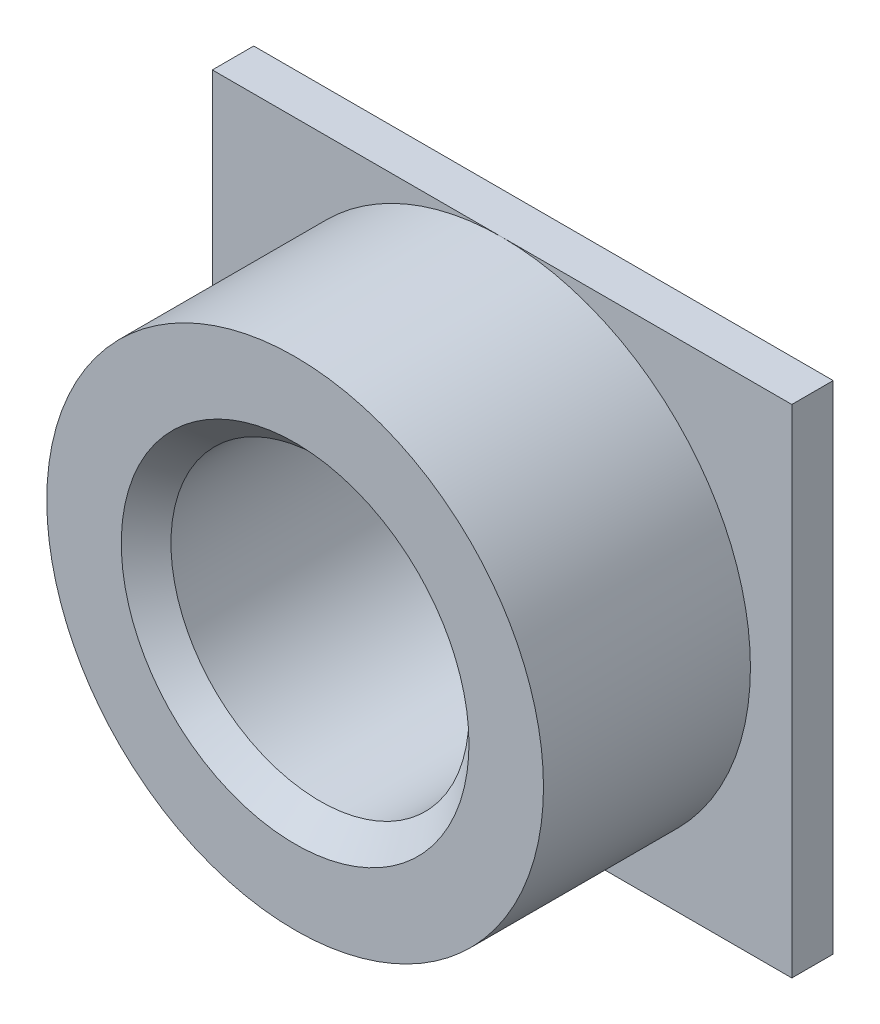
ISO-10303-21;
HEADER;
FILE_DESCRIPTION(('STEP AP214'),'2;1');
FILE_NAME('part.step','',(''),(''),'','','');
FILE_SCHEMA(('AUTOMOTIVE_DESIGN { 1 0 10303 214 1 1 1 1 }'));
ENDSEC;
DATA;
#1=APPLICATION_CONTEXT('core data for automotive mechanical design processes');
#2=APPLICATION_PROTOCOL_DEFINITION('international standard','automotive_design',2000,#1);
#3=PRODUCT_CONTEXT('',#1,'mechanical');
#4=PRODUCT('Part','Part','',(#3));
#5=PRODUCT_RELATED_PRODUCT_CATEGORY('part','',(#4));
#6=PRODUCT_DEFINITION_FORMATION('','',#4);
#7=PRODUCT_DEFINITION_CONTEXT('part definition',#1,'design');
#8=PRODUCT_DEFINITION('design','',#6,#7);
#9=PRODUCT_DEFINITION_SHAPE('','',#8);
#10=(LENGTH_UNIT() NAMED_UNIT(*) SI_UNIT(.MILLI.,.METRE.));
#11=(NAMED_UNIT(*) PLANE_ANGLE_UNIT() SI_UNIT($,.RADIAN.));
#12=(NAMED_UNIT(*) SI_UNIT($,.STERADIAN.) SOLID_ANGLE_UNIT());
#13=UNCERTAINTY_MEASURE_WITH_UNIT(LENGTH_MEASURE(1.E-05),#10,'distance_accuracy_value','');
#14=(GEOMETRIC_REPRESENTATION_CONTEXT(3) GLOBAL_UNCERTAINTY_ASSIGNED_CONTEXT((#13)) GLOBAL_UNIT_ASSIGNED_CONTEXT((#10,
#11,#12)) REPRESENTATION_CONTEXT('',''));
#15=CARTESIAN_POINT('',(0.,0.,0.));
#16=DIRECTION('',(0.,0.,1.));
#17=DIRECTION('',(1.,0.,0.));
#18=AXIS2_PLACEMENT_3D('',#15,#16,#17);
#19=CARTESIAN_POINT('',(12.799999987954,3.66000063419343,27.5000000000097));
#20=CARTESIAN_POINT('',(12.799999987954,5.46000063419343,27.5000000000097));
#21=CARTESIAN_POINT('',(10.999999987954,5.46000063419343,27.5000000000097));
#22=CARTESIAN_POINT('',(9.19999998795404,5.46000063419343,27.5000000000097));
#23=CARTESIAN_POINT('',(9.19999998795404,3.66000063419343,27.5000000000097));
#24=CARTESIAN_POINT('',(9.19999998795404,1.86000063419343,27.5000000000097));
#25=CARTESIAN_POINT('',(10.999999987954,1.86000063419343,27.5000000000097));
#26=CARTESIAN_POINT('',(12.799999987954,1.86000063419343,27.5000000000097));
#27=CARTESIAN_POINT('',(12.799999987954,3.66000063419343,27.5000000000097));
#28=CARTESIAN_POINT('',(12.799999987954,3.66000063419343,30.2000000000097));
#29=CARTESIAN_POINT('',(12.799999987954,5.46000063419343,30.2000000000097));
#30=CARTESIAN_POINT('',(10.999999987954,5.46000063419343,30.2000000000097));
#31=CARTESIAN_POINT('',(9.19999998795404,5.46000063419343,30.2000000000097));
#32=CARTESIAN_POINT('',(9.19999998795404,3.66000063419343,30.2000000000097));
#33=CARTESIAN_POINT('',(9.19999998795404,1.86000063419343,30.2000000000097));
#34=CARTESIAN_POINT('',(10.999999987954,1.86000063419343,30.2000000000097));
#35=CARTESIAN_POINT('',(12.799999987954,1.86000063419343,30.2000000000097));
#36=CARTESIAN_POINT('',(12.799999987954,3.66000063419343,30.2000000000097));
#37=(BOUNDED_SURFACE() B_SPLINE_SURFACE(1,2,((#19,#20,#21,#22,#23,#24,#25,#26,#27),(#28,#29,#30,
#31,#32,#33,#34,#35,#36)),.UNSPECIFIED.,.F.,.T.,.F.) B_SPLINE_SURFACE_WITH_KNOTS((2,2),(3,2,2,2,
3),(0.75,0.9),(0.,0.25,0.5,0.75,1.),
.UNSPECIFIED.) GEOMETRIC_REPRESENTATION_ITEM() RATIONAL_B_SPLINE_SURFACE(((1.,0.707106781186548,
1.,0.707106781186548,1.,0.707106781186548,1.,0.707106781186548,1.),(1.,0.707106781186548,1.,
0.707106781186548,1.,0.707106781186548,1.,0.707106781186548,1.))) REPRESENTATION_ITEM('') SURFACE());
#38=CARTESIAN_POINT('',(12.799999987954,3.66000063419343,30.2000000000097));
#39=CARTESIAN_POINT('',(12.799999987954,5.46000063419344,30.2000000000097));
#40=CARTESIAN_POINT('',(10.999999987954,5.46000063419343,30.2000000000097));
#41=CARTESIAN_POINT('',(9.19999998795401,5.46000063419342,30.2000000000097));
#42=CARTESIAN_POINT('',(9.19999998795401,3.66000063419341,30.2000000000097));
#43=CARTESIAN_POINT('',(9.19999998795404,1.8600006341934,30.2000000000097));
#44=CARTESIAN_POINT('',(10.999999987954,1.86000063419341,30.2000000000097));
#45=CARTESIAN_POINT('',(12.799999987954,1.86000063419342,30.2000000000097));
#46=CARTESIAN_POINT('',(12.799999987954,3.66000063419343,30.2000000000097));
#47=(BOUNDED_CURVE() B_SPLINE_CURVE(2,(#38,#39,#40,#41,#42,#43,#44,#45,#46),.UNSPECIFIED.,.T.,
.F.) B_SPLINE_CURVE_WITH_KNOTS((3,2,2,2,3),(0.,0.25,0.5,0.75,1.),
.UNSPECIFIED.) CURVE() GEOMETRIC_REPRESENTATION_ITEM() RATIONAL_B_SPLINE_CURVE((1.,
0.707106781186548,1.,0.707106781186548,1.,0.707106781186548,1.,0.707106781186548,1.)) REPRESENTATION_ITEM(''));
#48=CARTESIAN_POINT('',(12.799999987954,3.66000063419342,30.2000000000097));
#49=VERTEX_POINT('',#48);
#50=EDGE_CURVE('E11',#49,#49,#47,.T.);
#51=CARTESIAN_POINT('',(12.799999987954,3.66000063419343,27.5000000000097));
#52=CARTESIAN_POINT('',(12.799999987954,3.66000063419343,30.2000000000097));
#53=(BOUNDED_CURVE() B_SPLINE_CURVE(1,(#51,#52),.UNSPECIFIED.,.F.,
.F.) B_SPLINE_CURVE_WITH_KNOTS((2,2),(0.75,0.9),
.UNSPECIFIED.) CURVE() GEOMETRIC_REPRESENTATION_ITEM() RATIONAL_B_SPLINE_CURVE((1.,1.)) REPRESENTATION_ITEM(''));
#54=CARTESIAN_POINT('',(12.799999987954,3.66000063419343,27.5000000000097));
#55=VERTEX_POINT('',#54);
#56=EDGE_CURVE('E32',#55,#49,#53,.T.);
#57=CARTESIAN_POINT('',(12.799999987954,3.66000063419343,27.5000000000097));
#58=CARTESIAN_POINT('',(12.799999987954,5.46000063419343,27.5000000000097));
#59=CARTESIAN_POINT('',(10.999999987954,5.46000063419343,27.5000000000097));
#60=CARTESIAN_POINT('',(9.19999998795404,5.46000063419343,27.5000000000097));
#61=CARTESIAN_POINT('',(9.19999998795404,3.66000063419343,27.5000000000097));
#62=CARTESIAN_POINT('',(9.19999998795404,1.86000063419343,27.5000000000097));
#63=CARTESIAN_POINT('',(10.999999987954,1.86000063419343,27.5000000000097));
#64=CARTESIAN_POINT('',(12.799999987954,1.86000063419343,27.5000000000097));
#65=CARTESIAN_POINT('',(12.799999987954,3.66000063419343,27.5000000000097));
#66=(BOUNDED_CURVE() B_SPLINE_CURVE(2,(#57,#58,#59,#60,#61,#62,#63,#64,#65),.UNSPECIFIED.,.T.,
.F.) B_SPLINE_CURVE_WITH_KNOTS((3,2,2,2,3),(0.,0.25,0.5,0.75,1.),
.UNSPECIFIED.) CURVE() GEOMETRIC_REPRESENTATION_ITEM() RATIONAL_B_SPLINE_CURVE((1.,
0.707106781186548,1.,0.707106781186548,1.,0.707106781186548,1.,0.707106781186548,1.)) REPRESENTATION_ITEM(''));
#67=EDGE_CURVE('E193',#55,#55,#66,.T.);
#68=ORIENTED_EDGE('',*,*,#50,.T.);
#69=ORIENTED_EDGE('',*,*,#56,.F.);
#70=ORIENTED_EDGE('',*,*,#67,.F.);
#71=ORIENTED_EDGE('',*,*,#56,.T.);
#72=EDGE_LOOP('',(#68,#69,#70,#71));
#73=FACE_BOUND('',#72,.T.);
#74=ADVANCED_FACE('F17',(#73),#37,.T.);
#75=CARTESIAN_POINT('',(13.099999987954,3.66000063419342,30.5000000000097));
#76=CARTESIAN_POINT('',(12.799999987954,3.66000063419343,30.2000000000097));
#77=CARTESIAN_POINT('',(13.099999987954,5.76000063419343,30.5000000000097));
#78=CARTESIAN_POINT('',(12.799999987954,5.46000063419344,30.2000000000097));
#79=CARTESIAN_POINT('',(10.999999987954,5.76000063419343,30.5000000000097));
#80=CARTESIAN_POINT('',(10.999999987954,5.46000063419343,30.2000000000097));
#81=CARTESIAN_POINT('',(8.899999987954,5.76000063419342,30.5000000000097));
#82=CARTESIAN_POINT('',(9.19999998795401,5.46000063419342,30.2000000000097));
#83=CARTESIAN_POINT('',(8.89999998795401,3.66000063419341,30.5000000000097));
#84=CARTESIAN_POINT('',(9.19999998795401,3.66000063419341,30.2000000000097));
#85=CARTESIAN_POINT('',(8.89999998795401,1.5600006341934,30.5000000000097));
#86=CARTESIAN_POINT('',(9.19999998795404,1.8600006341934,30.2000000000097));
#87=CARTESIAN_POINT('',(10.999999987954,1.56000063419341,30.5000000000097));
#88=CARTESIAN_POINT('',(10.999999987954,1.86000063419341,30.2000000000097));
#89=CARTESIAN_POINT('',(13.099999987954,1.56000063419341,30.5000000000097));
#90=CARTESIAN_POINT('',(12.799999987954,1.86000063419342,30.2000000000097));
#91=CARTESIAN_POINT('',(13.099999987954,3.66000063419342,30.5000000000097));
#92=CARTESIAN_POINT('',(12.799999987954,3.66000063419343,30.2000000000097));
#93=(BOUNDED_SURFACE() B_SPLINE_SURFACE(2,1,((#75,#76),(#77,#78),(#79,#80),(#81,#82),(#83,#84),
(#85,#86),(#87,#88),(#89,#90),(#91,#92)),.UNSPECIFIED.,.T.,.F.,
.F.) B_SPLINE_SURFACE_WITH_KNOTS((3,2,2,2,3),(2,2),(0.,0.25,0.5,0.75,1.),(0.,1.),
.UNSPECIFIED.) GEOMETRIC_REPRESENTATION_ITEM() RATIONAL_B_SPLINE_SURFACE(((1.,1.),
(0.707106781186548,0.707106781186548),(1.,1.),(0.707106781186548,0.707106781186548),(1.,1.),
(0.707106781186548,0.707106781186548),(1.,1.),(0.707106781186548,0.707106781186548),(1.,1.))) REPRESENTATION_ITEM('') SURFACE());
#94=CARTESIAN_POINT('',(12.799999987954,3.66000063419343,30.2000000000097));
#95=CARTESIAN_POINT('',(13.099999987954,3.66000063419342,30.5000000000097));
#96=(BOUNDED_CURVE() B_SPLINE_CURVE(1,(#94,#95),.UNSPECIFIED.,.F.,
.F.) B_SPLINE_CURVE_WITH_KNOTS((2,2),(0.,1.),
.UNSPECIFIED.) CURVE() GEOMETRIC_REPRESENTATION_ITEM() RATIONAL_B_SPLINE_CURVE((1.,1.)) REPRESENTATION_ITEM(''));
#97=CARTESIAN_POINT('',(13.099999987954,3.66000063419342,30.5000000000097));
#98=VERTEX_POINT('',#97);
#99=EDGE_CURVE('E176',#49,#98,#96,.T.);
#100=CARTESIAN_POINT('',(13.099999987954,3.66000063419342,30.5000000000097));
#101=CARTESIAN_POINT('',(13.099999987954,5.76000063419343,30.5000000000097));
#102=CARTESIAN_POINT('',(10.999999987954,5.76000063419343,30.5000000000097));
#103=CARTESIAN_POINT('',(8.899999987954,5.76000063419342,30.5000000000097));
#104=CARTESIAN_POINT('',(8.89999998795401,3.66000063419341,30.5000000000097));
#105=CARTESIAN_POINT('',(8.89999998795401,1.5600006341934,30.5000000000097));
#106=CARTESIAN_POINT('',(10.999999987954,1.56000063419341,30.5000000000097));
#107=CARTESIAN_POINT('',(13.099999987954,1.56000063419341,30.5000000000097));
#108=CARTESIAN_POINT('',(13.099999987954,3.66000063419342,30.5000000000097));
#109=(BOUNDED_CURVE() B_SPLINE_CURVE(2,(#100,#101,#102,#103,#104,#105,#106,#107,#108),
.UNSPECIFIED.,.T.,.F.) B_SPLINE_CURVE_WITH_KNOTS((3,2,2,2,3),(0.,0.25,0.5,0.75,1.),
.UNSPECIFIED.) CURVE() GEOMETRIC_REPRESENTATION_ITEM() RATIONAL_B_SPLINE_CURVE((1.,
0.707106781186548,1.,0.707106781186548,1.,0.707106781186548,1.,0.707106781186548,1.)) REPRESENTATION_ITEM(''));
#110=EDGE_CURVE('E168',#98,#98,#109,.T.);
#111=ORIENTED_EDGE('',*,*,#99,.F.);
#112=ORIENTED_EDGE('',*,*,#50,.F.);
#113=ORIENTED_EDGE('',*,*,#99,.T.);
#114=ORIENTED_EDGE('',*,*,#110,.T.);
#115=EDGE_LOOP('',(#111,#112,#113,#114));
#116=FACE_BOUND('',#115,.T.);
#117=ADVANCED_FACE('F415',(#116),#93,.T.);
#118=CARTESIAN_POINT('',(14.0600006130211,0.600000092572848,30.5000000000097));
#119=CARTESIAN_POINT('',(7.9400006130211,0.600000092572848,30.5000000000097));
#120=CARTESIAN_POINT('',(14.0600006130211,6.72000009257285,30.5000000000097));
#121=CARTESIAN_POINT('',(7.9400006130211,6.72000009257285,30.5000000000097));
#122=(BOUNDED_SURFACE() B_SPLINE_SURFACE(1,1,((#118,#119),(#120,#121)),.UNSPECIFIED.,.F.,.F.,
.F.) B_SPLINE_SURFACE_WITH_KNOTS((2,2),(2,2),(0.310397637136094,0.653849502283845),
(0.323139541157773,0.666591406305524),
.UNSPECIFIED.) GEOMETRIC_REPRESENTATION_ITEM() RATIONAL_B_SPLINE_SURFACE(((1.,1.),(1.,1.))) REPRESENTATION_ITEM('') SURFACE());
#123=CARTESIAN_POINT('',(14.0000006130211,3.66000009257285,30.5000000000097));
#124=CARTESIAN_POINT('',(14.0000006130211,6.66000009257285,30.5000000000096));
#125=CARTESIAN_POINT('',(11.0000006130211,6.66000009257285,30.5000000000097));
#126=CARTESIAN_POINT('',(8.00000061302108,6.66000009257284,30.5000000000096));
#127=CARTESIAN_POINT('',(8.0000006130211,3.66000009257284,30.5000000000097));
#128=CARTESIAN_POINT('',(8.00000061302111,0.660000092572843,30.5000000000096));
#129=CARTESIAN_POINT('',(11.0000006130211,0.660000092572849,30.5000000000097));
#130=CARTESIAN_POINT('',(14.0000006130211,0.660000092572855,30.5000000000096));
#131=CARTESIAN_POINT('',(14.0000006130211,3.66000009257285,30.5000000000097));
#132=(BOUNDED_CURVE() B_SPLINE_CURVE(2,(#123,#124,#125,#126,#127,#128,#129,#130,#131),
.UNSPECIFIED.,.T.,.F.) B_SPLINE_CURVE_WITH_KNOTS((3,2,2,2,3),(0.,0.25,0.5,0.75,1.),
.UNSPECIFIED.) CURVE() GEOMETRIC_REPRESENTATION_ITEM() RATIONAL_B_SPLINE_CURVE((1.,
0.707106781186548,1.,0.707106781186548,1.,0.707106781186548,1.,0.707106781186548,1.)) REPRESENTATION_ITEM(''));
#133=CARTESIAN_POINT('',(14.0000006130211,3.66000009257285,30.5000000000097));
#134=VERTEX_POINT('',#133);
#135=EDGE_CURVE('E177',#134,#134,#132,.T.);
#136=ORIENTED_EDGE('',*,*,#135,.T.);
#137=EDGE_LOOP('',(#136));
#138=FACE_BOUND('',#137,.T.);
#139=ORIENTED_EDGE('',*,*,#110,.F.);
#140=EDGE_LOOP('',(#139));
#141=FACE_BOUND('',#140,.T.);
#142=ADVANCED_FACE('F405',(#138,#141),#122,.T.);
#143=CARTESIAN_POINT('',(14.0000006130211,3.66000009257285,28.0000000000097));
#144=CARTESIAN_POINT('',(14.0000006130211,3.66000009257285,30.5000000000097));
#145=CARTESIAN_POINT('',(14.0000006130211,6.66000009257285,28.0000000000097));
#146=CARTESIAN_POINT('',(14.0000006130211,6.66000009257285,30.5000000000096));
#147=CARTESIAN_POINT('',(11.0000006130211,6.66000009257285,28.0000000000097));
#148=CARTESIAN_POINT('',(11.0000006130211,6.66000009257285,30.5000000000097));
#149=CARTESIAN_POINT('',(8.00000061302108,6.66000009257285,28.0000000000097));
#150=CARTESIAN_POINT('',(8.00000061302108,6.66000009257285,30.5000000000096));
#151=CARTESIAN_POINT('',(8.0000006130211,3.66000009257285,28.0000000000097));
#152=CARTESIAN_POINT('',(8.0000006130211,3.66000009257285,30.5000000000097));
#153=CARTESIAN_POINT('',(8.00000061302108,0.660000092572855,28.0000000000097));
#154=CARTESIAN_POINT('',(8.00000061302108,0.660000092572855,30.5000000000096));
#155=CARTESIAN_POINT('',(11.0000006130211,0.660000092572854,28.0000000000097));
#156=CARTESIAN_POINT('',(11.0000006130211,0.660000092572854,30.5000000000097));
#157=CARTESIAN_POINT('',(14.0000006130211,0.660000092572855,28.0000000000097));
#158=CARTESIAN_POINT('',(14.0000006130211,0.660000092572855,30.5000000000096));
#159=CARTESIAN_POINT('',(14.0000006130211,3.66000009257285,28.0000000000097));
#160=CARTESIAN_POINT('',(14.0000006130211,3.66000009257285,30.5000000000097));
#161=(BOUNDED_SURFACE() B_SPLINE_SURFACE(2,1,((#143,#144),(#145,#146),(#147,#148),(#149,#150),
(#151,#152),(#153,#154),(#155,#156),(#157,#158),(#159,#160)),.UNSPECIFIED.,.T.,.F.,
.F.) B_SPLINE_SURFACE_WITH_KNOTS((3,2,2,2,3),(2,2),(0.,0.25,0.5,0.75,1.),(0.,0.88),
.UNSPECIFIED.) GEOMETRIC_REPRESENTATION_ITEM() RATIONAL_B_SPLINE_SURFACE(((1.,1.),
(0.707106781186548,0.707106781186548),(1.,1.),(0.707106781186548,0.707106781186548),(1.,1.),
(0.707106781186548,0.707106781186548),(1.,1.),(0.707106781186548,0.707106781186548),(1.,1.))) REPRESENTATION_ITEM('') SURFACE());
#162=CARTESIAN_POINT('',(14.0000006130211,3.66000009257285,28.0000000000097));
#163=CARTESIAN_POINT('',(14.0000006130211,3.66000009257285,30.5000000000097));
#164=(BOUNDED_CURVE() B_SPLINE_CURVE(1,(#162,#163),.UNSPECIFIED.,.F.,
.F.) B_SPLINE_CURVE_WITH_KNOTS((2,2),(0.,0.88),
.UNSPECIFIED.) CURVE() GEOMETRIC_REPRESENTATION_ITEM() RATIONAL_B_SPLINE_CURVE((1.,1.)) REPRESENTATION_ITEM(''));
#165=CARTESIAN_POINT('',(14.0000006130211,3.66000009257285,28.0000000000097));
#166=VERTEX_POINT('',#165);
#167=EDGE_CURVE('E149',#166,#134,#164,.T.);
#168=CARTESIAN_POINT('',(14.0000006130211,3.66000009257285,28.0000000000097));
#169=CARTESIAN_POINT('',(14.0000006130211,6.66000009257285,28.0000000000097));
#170=CARTESIAN_POINT('',(11.0000006130211,6.66000009257285,28.0000000000097));
#171=(BOUNDED_CURVE() B_SPLINE_CURVE(2,(#168,#169,#170),.UNSPECIFIED.,.F.,
.F.) B_SPLINE_CURVE_WITH_KNOTS((3,3),(0.,0.25),
.UNSPECIFIED.) CURVE() GEOMETRIC_REPRESENTATION_ITEM() RATIONAL_B_SPLINE_CURVE((1.,
0.707106781186548,1.)) REPRESENTATION_ITEM(''));
#172=CARTESIAN_POINT('',(11.0000006130211,6.66000063419342,28.0000000000097));
#173=VERTEX_POINT('',#172);
#174=EDGE_CURVE('E238',#166,#173,#171,.T.);
#175=CARTESIAN_POINT('',(11.0000006130211,6.66000009257285,28.0000000000097));
#176=CARTESIAN_POINT('',(8.00000061302108,6.66000009257284,28.0000000000097));
#177=CARTESIAN_POINT('',(8.0000006130211,3.66000009257284,28.0000000000097));
#178=CARTESIAN_POINT('',(8.00000061302111,0.660000092572843,28.0000000000097));
#179=CARTESIAN_POINT('',(11.0000006130211,0.660000092572849,28.0000000000097));
#180=(BOUNDED_CURVE() B_SPLINE_CURVE(2,(#175,#176,#177,#178,#179),.UNSPECIFIED.,.F.,
.F.) B_SPLINE_CURVE_WITH_KNOTS((3,2,3),(0.25,0.5,0.75),
.UNSPECIFIED.) CURVE() GEOMETRIC_REPRESENTATION_ITEM() RATIONAL_B_SPLINE_CURVE((1.,
0.707106781186548,1.,0.707106781186548,1.)) REPRESENTATION_ITEM(''));
#181=CARTESIAN_POINT('',(11.0000006130211,0.66000063419342,28.0000000000097));
#182=VERTEX_POINT('',#181);
#183=EDGE_CURVE('E192',#173,#182,#180,.T.);
#184=CARTESIAN_POINT('',(11.0000006130211,0.660000092572849,28.0000000000097));
#185=CARTESIAN_POINT('',(14.0000006130211,0.660000092572855,28.0000000000097));
#186=CARTESIAN_POINT('',(14.0000006130211,3.66000009257285,28.0000000000097));
#187=(BOUNDED_CURVE() B_SPLINE_CURVE(2,(#184,#185,#186),.UNSPECIFIED.,.F.,
.F.) B_SPLINE_CURVE_WITH_KNOTS((3,3),(0.75,1.),
.UNSPECIFIED.) CURVE() GEOMETRIC_REPRESENTATION_ITEM() RATIONAL_B_SPLINE_CURVE((1.,
0.707106781186548,1.)) REPRESENTATION_ITEM(''));
#188=EDGE_CURVE('E158',#182,#166,#187,.T.);
#189=ORIENTED_EDGE('',*,*,#167,.F.);
#190=ORIENTED_EDGE('',*,*,#174,.T.);
#191=ORIENTED_EDGE('',*,*,#183,.T.);
#192=ORIENTED_EDGE('',*,*,#188,.T.);
#193=ORIENTED_EDGE('',*,*,#167,.T.);
#194=ORIENTED_EDGE('',*,*,#135,.F.);
#195=EDGE_LOOP('',(#189,#190,#191,#192,#193,#194));
#196=FACE_BOUND('',#195,.T.);
#197=ADVANCED_FACE('F396',(#196),#161,.T.);
#198=CARTESIAN_POINT('',(11.0000006130211,0.660000634193421,28.0000000000097));
#199=CARTESIAN_POINT('',(7.49999998795403,0.660000634193421,28.0000000000097));
#200=CARTESIAN_POINT('',(11.0000006130211,6.66000063419342,28.0000000000097));
#201=CARTESIAN_POINT('',(7.49999998795403,6.66000063419342,28.0000000000097));
#202=(BOUNDED_SURFACE() B_SPLINE_SURFACE(1,1,((#198,#199),(#200,#201)),.UNSPECIFIED.,.F.,.F.,
.F.) B_SPLINE_SURFACE_WITH_KNOTS((2,2),(2,2),(0.345049672986674,0.654950327013326),
(0.499999967715218,0.680775381515547),
.UNSPECIFIED.) GEOMETRIC_REPRESENTATION_ITEM() RATIONAL_B_SPLINE_SURFACE(((1.,1.),(1.,1.))) REPRESENTATION_ITEM('') SURFACE());
#203=CARTESIAN_POINT('',(11.0000006130211,6.66000063419342,28.0000000000097));
#204=CARTESIAN_POINT('',(7.49999998795404,6.66000063419342,28.0000000000097));
#205=(BOUNDED_CURVE() B_SPLINE_CURVE(1,(#203,#204),.UNSPECIFIED.,.F.,
.F.) B_SPLINE_CURVE_WITH_KNOTS((2,2),(16.4999993749329,20.),
.UNSPECIFIED.) CURVE() GEOMETRIC_REPRESENTATION_ITEM() RATIONAL_B_SPLINE_CURVE((1.,1.)) REPRESENTATION_ITEM(''));
#206=CARTESIAN_POINT('',(7.49999998795404,6.66000063419342,28.0000000000097));
#207=VERTEX_POINT('',#206);
#208=EDGE_CURVE('E159',#173,#207,#205,.T.);
#209=CARTESIAN_POINT('',(7.49999998795404,6.66000063419342,28.0000000000097));
#210=CARTESIAN_POINT('',(7.49999998795404,0.660000634193423,28.0000000000097));
#211=(BOUNDED_CURVE() B_SPLINE_CURVE(1,(#209,#210),.UNSPECIFIED.,.F.,
.F.) B_SPLINE_CURVE_WITH_KNOTS((2,2),(20.,26.),
.UNSPECIFIED.) CURVE() GEOMETRIC_REPRESENTATION_ITEM() RATIONAL_B_SPLINE_CURVE((1.,1.)) REPRESENTATION_ITEM(''));
#212=CARTESIAN_POINT('',(7.49999998795404,0.66000063419342,28.0000000000097));
#213=VERTEX_POINT('',#212);
#214=EDGE_CURVE('E160',#207,#213,#211,.T.);
#215=CARTESIAN_POINT('',(7.49999998795404,0.660000634193423,28.0000000000097));
#216=CARTESIAN_POINT('',(11.0000006130211,0.660000634193423,28.0000000000097));
#217=(BOUNDED_CURVE() B_SPLINE_CURVE(1,(#215,#216),.UNSPECIFIED.,.F.,
.F.) B_SPLINE_CURVE_WITH_KNOTS((2,2),(0.,3.50000062506707),
.UNSPECIFIED.) CURVE() GEOMETRIC_REPRESENTATION_ITEM() RATIONAL_B_SPLINE_CURVE((1.,1.)) REPRESENTATION_ITEM(''));
#218=EDGE_CURVE('E76',#213,#182,#217,.T.);
#219=ORIENTED_EDGE('',*,*,#208,.T.);
#220=ORIENTED_EDGE('',*,*,#214,.T.);
#221=ORIENTED_EDGE('',*,*,#218,.T.);
#222=ORIENTED_EDGE('',*,*,#183,.F.);
#223=EDGE_LOOP('',(#219,#220,#221,#222));
#224=FACE_BOUND('',#223,.T.);
#225=ADVANCED_FACE('F387',(#224),#202,.T.);
#226=CARTESIAN_POINT('',(14.499999987954,6.66000063419342,28.0000000000097));
#227=CARTESIAN_POINT('',(7.49999998795404,6.66000063419342,28.0000000000097));
#228=CARTESIAN_POINT('',(14.499999987954,6.66000063419342,27.5000000000097));
#229=CARTESIAN_POINT('',(7.49999998795404,6.66000063419342,27.5000000000097));
#230=(BOUNDED_SURFACE() B_SPLINE_SURFACE(1,1,((#226,#227),(#228,#229)),.UNSPECIFIED.,.F.,.F.,
.F.) B_SPLINE_SURFACE_WITH_KNOTS((2,2),(2,2),(0.,0.0400000000000006),(13.,20.),
.UNSPECIFIED.) GEOMETRIC_REPRESENTATION_ITEM() RATIONAL_B_SPLINE_SURFACE(((1.,1.),(1.,1.))) REPRESENTATION_ITEM('') SURFACE());
#231=CARTESIAN_POINT('',(14.499999987954,6.66000063419342,28.0000000000097));
#232=CARTESIAN_POINT('',(11.0000006130211,6.66000063419342,28.0000000000097));
#233=(BOUNDED_CURVE() B_SPLINE_CURVE(1,(#231,#232),.UNSPECIFIED.,.F.,
.F.) B_SPLINE_CURVE_WITH_KNOTS((2,2),(13.,16.4999993749329),
.UNSPECIFIED.) CURVE() GEOMETRIC_REPRESENTATION_ITEM() RATIONAL_B_SPLINE_CURVE((1.,1.)) REPRESENTATION_ITEM(''));
#234=CARTESIAN_POINT('',(14.499999987954,6.66000063419342,28.0000000000097));
#235=VERTEX_POINT('',#234);
#236=EDGE_CURVE('E92',#235,#173,#233,.T.);
#237=CARTESIAN_POINT('',(14.499999987954,6.66000063419342,28.0000000000097));
#238=CARTESIAN_POINT('',(14.499999987954,6.66000063419342,27.5000000000097));
#239=(BOUNDED_CURVE() B_SPLINE_CURVE(1,(#237,#238),.UNSPECIFIED.,.F.,
.F.) B_SPLINE_CURVE_WITH_KNOTS((2,2),(0.,0.0400000000000006),
.UNSPECIFIED.) CURVE() GEOMETRIC_REPRESENTATION_ITEM() RATIONAL_B_SPLINE_CURVE((1.,1.)) REPRESENTATION_ITEM(''));
#240=CARTESIAN_POINT('',(14.499999987954,6.66000063419342,27.5000000000097));
#241=VERTEX_POINT('',#240);
#242=EDGE_CURVE('E202',#235,#241,#239,.T.);
#243=CARTESIAN_POINT('',(7.49999998795404,6.66000063419342,27.5000000000097));
#244=CARTESIAN_POINT('',(14.499999987954,6.66000063419342,27.5000000000097));
#245=(BOUNDED_CURVE() B_SPLINE_CURVE(1,(#243,#244),.UNSPECIFIED.,.F.,
.F.) B_SPLINE_CURVE_WITH_KNOTS((2,2),(0.0833333333333337,0.916666666666666),
.UNSPECIFIED.) CURVE() GEOMETRIC_REPRESENTATION_ITEM() RATIONAL_B_SPLINE_CURVE((1.,1.)) REPRESENTATION_ITEM(''));
#246=CARTESIAN_POINT('',(7.49999998795404,6.66000063419342,27.5000000000097));
#247=VERTEX_POINT('',#246);
#248=EDGE_CURVE('E127',#247,#241,#245,.T.);
#249=CARTESIAN_POINT('',(7.49999998795404,6.66000063419342,28.0000000000097));
#250=CARTESIAN_POINT('',(7.49999998795404,6.66000063419342,27.5000000000097));
#251=(BOUNDED_CURVE() B_SPLINE_CURVE(1,(#249,#250),.UNSPECIFIED.,.F.,
.F.) B_SPLINE_CURVE_WITH_KNOTS((2,2),(0.,0.04),
.UNSPECIFIED.) CURVE() GEOMETRIC_REPRESENTATION_ITEM() RATIONAL_B_SPLINE_CURVE((1.,1.)) REPRESENTATION_ITEM(''));
#252=EDGE_CURVE('E217',#207,#247,#251,.T.);
#253=ORIENTED_EDGE('',*,*,#236,.F.);
#254=ORIENTED_EDGE('',*,*,#242,.T.);
#255=ORIENTED_EDGE('',*,*,#248,.F.);
#256=ORIENTED_EDGE('',*,*,#252,.F.);
#257=ORIENTED_EDGE('',*,*,#208,.F.);
#258=EDGE_LOOP('',(#253,#254,#255,#256,#257));
#259=FACE_BOUND('',#258,.T.);
#260=ADVANCED_FACE('F267',(#259),#230,.T.);
#261=CARTESIAN_POINT('',(14.499999987954,0.660000634193421,28.0000000000097));
#262=CARTESIAN_POINT('',(11.0000006130211,0.660000634193421,28.0000000000097));
#263=CARTESIAN_POINT('',(14.499999987954,6.66000063419342,28.0000000000097));
#264=CARTESIAN_POINT('',(11.0000006130211,6.66000063419342,28.0000000000097));
#265=(BOUNDED_SURFACE() B_SPLINE_SURFACE(1,1,((#261,#262),(#263,#264)),.UNSPECIFIED.,.F.,.F.,
.F.) B_SPLINE_SURFACE_WITH_KNOTS((2,2),(2,2),(0.345049672986674,0.654950327013326),
(0.319224618484453,0.499999967715218),
.UNSPECIFIED.) GEOMETRIC_REPRESENTATION_ITEM() RATIONAL_B_SPLINE_SURFACE(((1.,1.),(1.,1.))) REPRESENTATION_ITEM('') SURFACE());
#266=CARTESIAN_POINT('',(11.0000006130211,0.660000634193423,28.0000000000097));
#267=CARTESIAN_POINT('',(14.499999987954,0.660000634193423,28.0000000000097));
#268=(BOUNDED_CURVE() B_SPLINE_CURVE(1,(#266,#267),.UNSPECIFIED.,.F.,
.F.) B_SPLINE_CURVE_WITH_KNOTS((2,2),(3.50000062506707,7.),
.UNSPECIFIED.) CURVE() GEOMETRIC_REPRESENTATION_ITEM() RATIONAL_B_SPLINE_CURVE((1.,1.)) REPRESENTATION_ITEM(''));
#269=CARTESIAN_POINT('',(14.499999987954,0.66000063419342,28.0000000000097));
#270=VERTEX_POINT('',#269);
#271=EDGE_CURVE('E23',#182,#270,#268,.T.);
#272=CARTESIAN_POINT('',(14.499999987954,0.660000634193423,28.0000000000097));
#273=CARTESIAN_POINT('',(14.499999987954,6.66000063419342,28.0000000000097));
#274=(BOUNDED_CURVE() B_SPLINE_CURVE(1,(#272,#273),.UNSPECIFIED.,.F.,
.F.) B_SPLINE_CURVE_WITH_KNOTS((2,2),(7.,13.),
.UNSPECIFIED.) CURVE() GEOMETRIC_REPRESENTATION_ITEM() RATIONAL_B_SPLINE_CURVE((1.,1.)) REPRESENTATION_ITEM(''));
#275=EDGE_CURVE('E124',#270,#235,#274,.T.);
#276=ORIENTED_EDGE('',*,*,#236,.T.);
#277=ORIENTED_EDGE('',*,*,#174,.F.);
#278=ORIENTED_EDGE('',*,*,#188,.F.);
#279=ORIENTED_EDGE('',*,*,#271,.T.);
#280=ORIENTED_EDGE('',*,*,#275,.T.);
#281=EDGE_LOOP('',(#276,#277,#278,#279,#280));
#282=FACE_BOUND('',#281,.T.);
#283=ADVANCED_FACE('F270',(#282),#265,.T.);
#284=CARTESIAN_POINT('',(7.49999998795404,6.66000063419342,28.0000000000097));
#285=CARTESIAN_POINT('',(7.49999998795404,0.660000634193422,28.0000000000097));
#286=CARTESIAN_POINT('',(7.49999998795404,6.66000063419342,27.5000000000097));
#287=CARTESIAN_POINT('',(7.49999998795404,0.660000634193422,27.5000000000097));
#288=(BOUNDED_SURFACE() B_SPLINE_SURFACE(1,1,((#284,#285),(#286,#287)),.UNSPECIFIED.,.F.,.F.,
.F.) B_SPLINE_SURFACE_WITH_KNOTS((2,2),(2,2),(0.,0.04),(20.,26.),
.UNSPECIFIED.) GEOMETRIC_REPRESENTATION_ITEM() RATIONAL_B_SPLINE_SURFACE(((1.,1.),(1.,1.))) REPRESENTATION_ITEM('') SURFACE());
#289=CARTESIAN_POINT('',(7.49999998795404,0.660000634193423,27.5000000000097));
#290=CARTESIAN_POINT('',(7.49999998795404,5.91000063419341,27.5000000000097));
#291=CARTESIAN_POINT('',(7.49999998795404,6.66000063419342,27.5000000000097));
#292=(BOUNDED_CURVE() B_SPLINE_CURVE(1,(#289,#290,#291),.UNSPECIFIED.,.F.,
.F.) B_SPLINE_CURVE_WITH_KNOTS((2,1,2),(0.361111111111171,0.847222222222228,1.84722222222223),
.UNSPECIFIED.) CURVE() GEOMETRIC_REPRESENTATION_ITEM() RATIONAL_B_SPLINE_CURVE((1.,1.,1.)) REPRESENTATION_ITEM(''));
#293=CARTESIAN_POINT('',(7.49999998795404,0.660000634193428,27.5000000000097));
#294=VERTEX_POINT('',#293);
#295=EDGE_CURVE('E118',#294,#247,#292,.T.);
#296=CARTESIAN_POINT('',(7.49999998795404,0.660000634193423,28.0000000000097));
#297=CARTESIAN_POINT('',(7.49999998795404,0.660000634193423,27.5000000000097));
#298=(BOUNDED_CURVE() B_SPLINE_CURVE(1,(#296,#297),.UNSPECIFIED.,.F.,
.F.) B_SPLINE_CURVE_WITH_KNOTS((2,2),(0.,0.04),
.UNSPECIFIED.) CURVE() GEOMETRIC_REPRESENTATION_ITEM() RATIONAL_B_SPLINE_CURVE((1.,1.)) REPRESENTATION_ITEM(''));
#299=EDGE_CURVE('E112',#213,#294,#298,.T.);
#300=ORIENTED_EDGE('',*,*,#252,.T.);
#301=ORIENTED_EDGE('',*,*,#295,.F.);
#302=ORIENTED_EDGE('',*,*,#299,.F.);
#303=ORIENTED_EDGE('',*,*,#214,.F.);
#304=EDGE_LOOP('',(#300,#301,#302,#303));
#305=FACE_BOUND('',#304,.T.);
#306=ADVANCED_FACE('F19',(#305),#288,.T.);
#307=CARTESIAN_POINT('',(7.49999998795404,0.660000634193423,28.0000000000097));
#308=CARTESIAN_POINT('',(14.499999987954,0.660000634193423,28.0000000000097));
#309=CARTESIAN_POINT('',(7.49999998795404,0.660000634193423,27.5000000000097));
#310=CARTESIAN_POINT('',(14.499999987954,0.660000634193423,27.5000000000097));
#311=(BOUNDED_SURFACE() B_SPLINE_SURFACE(1,1,((#307,#308),(#309,#310)),.UNSPECIFIED.,.F.,.F.,
.F.) B_SPLINE_SURFACE_WITH_KNOTS((2,2),(2,2),(0.,0.0400000000000012),(0.,7.),
.UNSPECIFIED.) GEOMETRIC_REPRESENTATION_ITEM() RATIONAL_B_SPLINE_SURFACE(((1.,1.),(1.,1.))) REPRESENTATION_ITEM('') SURFACE());
#312=CARTESIAN_POINT('',(14.499999987954,0.660000634193423,27.5000000000097));
#313=CARTESIAN_POINT('',(7.49999998795404,0.660000634193423,27.5000000000097));
#314=(BOUNDED_CURVE() B_SPLINE_CURVE(1,(#312,#313),.UNSPECIFIED.,.F.,
.F.) B_SPLINE_CURVE_WITH_KNOTS((2,2),(0.141285930203487,0.875797552538409),
.UNSPECIFIED.) CURVE() GEOMETRIC_REPRESENTATION_ITEM() RATIONAL_B_SPLINE_CURVE((1.,1.)) REPRESENTATION_ITEM(''));
#315=CARTESIAN_POINT('',(14.499999987954,0.660000634193428,27.5000000000097));
#316=VERTEX_POINT('',#315);
#317=EDGE_CURVE('E107',#316,#294,#314,.T.);
#318=CARTESIAN_POINT('',(14.499999987954,0.660000634193423,28.0000000000097));
#319=CARTESIAN_POINT('',(14.499999987954,0.660000634193423,27.5000000000097));
#320=(BOUNDED_CURVE() B_SPLINE_CURVE(1,(#318,#319),.UNSPECIFIED.,.F.,
.F.) B_SPLINE_CURVE_WITH_KNOTS((2,2),(0.,0.04),
.UNSPECIFIED.) CURVE() GEOMETRIC_REPRESENTATION_ITEM() RATIONAL_B_SPLINE_CURVE((1.,1.)) REPRESENTATION_ITEM(''));
#321=EDGE_CURVE('E110',#270,#316,#320,.T.);
#322=ORIENTED_EDGE('',*,*,#218,.F.);
#323=ORIENTED_EDGE('',*,*,#299,.T.);
#324=ORIENTED_EDGE('',*,*,#317,.F.);
#325=ORIENTED_EDGE('',*,*,#321,.F.);
#326=ORIENTED_EDGE('',*,*,#271,.F.);
#327=EDGE_LOOP('',(#322,#323,#324,#325,#326));
#328=FACE_BOUND('',#327,.T.);
#329=ADVANCED_FACE('F109',(#328),#311,.T.);
#330=CARTESIAN_POINT('',(14.499999987954,0.660000634193422,28.0000000000097));
#331=CARTESIAN_POINT('',(14.499999987954,6.66000063419342,28.0000000000097));
#332=CARTESIAN_POINT('',(14.499999987954,0.660000634193422,27.5000000000097));
#333=CARTESIAN_POINT('',(14.499999987954,6.66000063419342,27.5000000000097));
#334=(BOUNDED_SURFACE() B_SPLINE_SURFACE(1,1,((#330,#331),(#332,#333)),.UNSPECIFIED.,.F.,.F.,
.F.) B_SPLINE_SURFACE_WITH_KNOTS((2,2),(2,2),(0.,0.0400000000000006),(7.,13.),
.UNSPECIFIED.) GEOMETRIC_REPRESENTATION_ITEM() RATIONAL_B_SPLINE_SURFACE(((1.,1.),(1.,1.))) REPRESENTATION_ITEM('') SURFACE());
#335=CARTESIAN_POINT('',(14.499999987954,6.66000063419342,27.5000000000097));
#336=CARTESIAN_POINT('',(14.499999987954,5.91000063419342,27.5000000000097));
#337=CARTESIAN_POINT('',(14.499999987954,0.660000634193424,27.5000000000097));
#338=(BOUNDED_CURVE() B_SPLINE_CURVE(1,(#335,#336,#337),.UNSPECIFIED.,.F.,
.F.) B_SPLINE_CURVE_WITH_KNOTS((2,1,2),(-1.,0.,0.486111111111056),
.UNSPECIFIED.) CURVE() GEOMETRIC_REPRESENTATION_ITEM() RATIONAL_B_SPLINE_CURVE((1.,1.,1.)) REPRESENTATION_ITEM(''));
#339=EDGE_CURVE('E117',#241,#316,#338,.T.);
#340=ORIENTED_EDGE('',*,*,#275,.F.);
#341=ORIENTED_EDGE('',*,*,#321,.T.);
#342=ORIENTED_EDGE('',*,*,#339,.F.);
#343=ORIENTED_EDGE('',*,*,#242,.F.);
#344=EDGE_LOOP('',(#340,#341,#342,#343));
#345=FACE_BOUND('',#344,.T.);
#346=ADVANCED_FACE('F122',(#345),#334,.T.);
#347=CARTESIAN_POINT('',(14.499999987954,0.660000634193423,27.5000000000097));
#348=CARTESIAN_POINT('',(14.499999987954,6.66000063419342,27.5000000000097));
#349=CARTESIAN_POINT('',(7.49999998795404,0.660000634193423,27.5000000000097));
#350=CARTESIAN_POINT('',(7.49999998795404,6.66000063419342,27.5000000000097));
#351=(BOUNDED_SURFACE() B_SPLINE_SURFACE(1,1,((#347,#348),(#349,#350)),.UNSPECIFIED.,.F.,.F.,
.F.) B_SPLINE_SURFACE_WITH_KNOTS((2,2),(2,2),(1.34647496561116,8.34647496561116),
(3.90000000000108,9.90000000000108),
.UNSPECIFIED.) GEOMETRIC_REPRESENTATION_ITEM() RATIONAL_B_SPLINE_SURFACE(((1.,1.),(1.,1.))) REPRESENTATION_ITEM('') SURFACE());
#352=ORIENTED_EDGE('',*,*,#248,.T.);
#353=ORIENTED_EDGE('',*,*,#339,.T.);
#354=ORIENTED_EDGE('',*,*,#317,.T.);
#355=ORIENTED_EDGE('',*,*,#295,.T.);
#356=EDGE_LOOP('',(#352,#353,#354,#355));
#357=FACE_BOUND('',#356,.T.);
#358=ORIENTED_EDGE('',*,*,#67,.T.);
#359=EDGE_LOOP('',(#358));
#360=FACE_BOUND('',#359,.T.);
#361=ADVANCED_FACE('F129',(#357,#360),#351,.T.);
#362=CLOSED_SHELL('',(#74,#117,#142,#197,#225,#260,#283,#306,#329,#346,#361));
#363=MANIFOLD_SOLID_BREP('B1',#362);
#364=ADVANCED_BREP_SHAPE_REPRESENTATION('',(#18,#363),#14);
#365=SHAPE_DEFINITION_REPRESENTATION(#9,#364);
ENDSEC;
END-ISO-10303-21;
